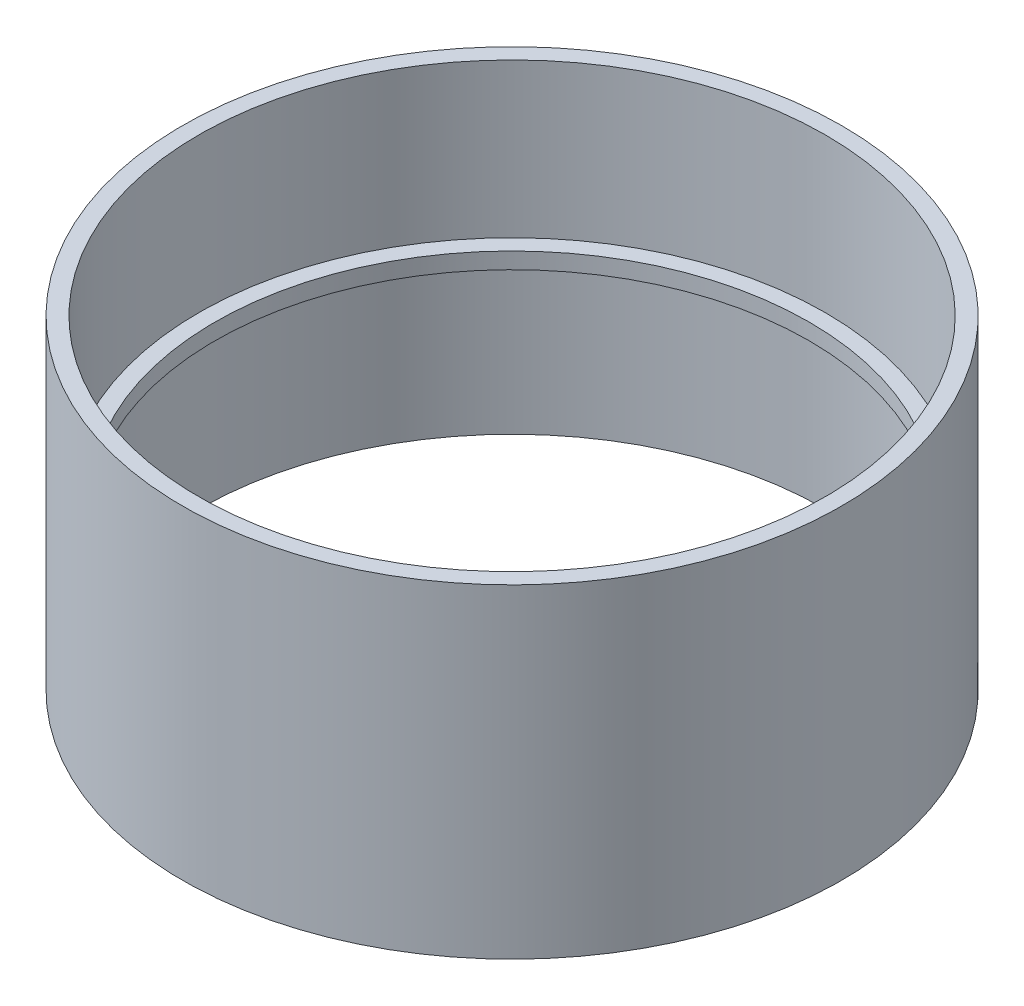
ISO-10303-21;
HEADER;
FILE_DESCRIPTION(('STEP AP214'),'2;1');
FILE_NAME('part.step','',(''),(''),'','','');
FILE_SCHEMA(('AUTOMOTIVE_DESIGN { 1 0 10303 214 1 1 1 1 }'));
ENDSEC;
DATA;
#1=APPLICATION_CONTEXT('core data for automotive mechanical design processes');
#2=APPLICATION_PROTOCOL_DEFINITION('international standard','automotive_design',2000,#1);
#3=PRODUCT_CONTEXT('',#1,'mechanical');
#4=PRODUCT('Part','Part','',(#3));
#5=PRODUCT_RELATED_PRODUCT_CATEGORY('part','',(#4));
#6=PRODUCT_DEFINITION_FORMATION('','',#4);
#7=PRODUCT_DEFINITION_CONTEXT('part definition',#1,'design');
#8=PRODUCT_DEFINITION('design','',#6,#7);
#9=PRODUCT_DEFINITION_SHAPE('','',#8);
#10=(LENGTH_UNIT() NAMED_UNIT(*) SI_UNIT(.MILLI.,.METRE.));
#11=(NAMED_UNIT(*) PLANE_ANGLE_UNIT() SI_UNIT($,.RADIAN.));
#12=(NAMED_UNIT(*) SI_UNIT($,.STERADIAN.) SOLID_ANGLE_UNIT());
#13=UNCERTAINTY_MEASURE_WITH_UNIT(LENGTH_MEASURE(1.E-05),#10,'distance_accuracy_value','');
#14=(GEOMETRIC_REPRESENTATION_CONTEXT(3) GLOBAL_UNCERTAINTY_ASSIGNED_CONTEXT((#13)) GLOBAL_UNIT_ASSIGNED_CONTEXT((#10,
#11,#12)) REPRESENTATION_CONTEXT('',''));
#15=CARTESIAN_POINT('',(0.,0.,0.));
#16=DIRECTION('',(0.,0.,1.));
#17=DIRECTION('',(1.,0.,0.));
#18=AXIS2_PLACEMENT_3D('',#15,#16,#17);
#19=CARTESIAN_POINT('',(0.,15.75,0.));
#20=DIRECTION('',(0.,1.,0.));
#21=DIRECTION('',(0.,0.,1.));
#22=AXIS2_PLACEMENT_3D('',#19,#20,#21);
#23=PLANE('',#22);
#24=CARTESIAN_POINT('',(0.,15.75,0.));
#25=DIRECTION('',(0.,-1.,0.));
#26=DIRECTION('',(0.,0.,-1.));
#27=AXIS2_PLACEMENT_3D('',#24,#25,#26);
#28=CIRCLE('',#27,27.5);
#29=CARTESIAN_POINT('',(0.,15.75,-27.5));
#30=VERTEX_POINT('',#29);
#31=EDGE_CURVE('E10',#30,#30,#28,.T.);
#32=ORIENTED_EDGE('',*,*,#31,.T.);
#33=EDGE_LOOP('',(#32));
#34=FACE_BOUND('',#33,.T.);
#35=CARTESIAN_POINT('',(0.,15.75,0.));
#36=DIRECTION('',(0.,-1.,0.));
#37=DIRECTION('',(0.,0.,-1.));
#38=AXIS2_PLACEMENT_3D('',#35,#36,#37);
#39=CIRCLE('',#38,29.);
#40=CARTESIAN_POINT('',(0.,15.75,-29.));
#41=VERTEX_POINT('',#40);
#42=EDGE_CURVE('E62',#41,#41,#39,.T.);
#43=ORIENTED_EDGE('',*,*,#42,.F.);
#44=EDGE_LOOP('',(#43));
#45=FACE_BOUND('',#44,.T.);
#46=ADVANCED_FACE('F34',(#34,#45),#23,.T.);
#47=CARTESIAN_POINT('',(0.,0.,0.));
#48=DIRECTION('',(0.,-1.,0.));
#49=DIRECTION('',(0.,0.,-1.));
#50=AXIS2_PLACEMENT_3D('',#47,#48,#49);
#51=CYLINDRICAL_SURFACE('',#50,27.5);
#52=CARTESIAN_POINT('',(0.,14.25,0.));
#53=DIRECTION('',(0.,-1.,0.));
#54=DIRECTION('',(0.,0.,-1.));
#55=AXIS2_PLACEMENT_3D('',#52,#53,#54);
#56=CIRCLE('',#55,27.5);
#57=CARTESIAN_POINT('',(0.,14.25,-27.5));
#58=VERTEX_POINT('',#57);
#59=EDGE_CURVE('E40',#58,#58,#56,.T.);
#60=ORIENTED_EDGE('',*,*,#59,.T.);
#61=EDGE_LOOP('',(#60));
#62=FACE_BOUND('',#61,.T.);
#63=ORIENTED_EDGE('',*,*,#31,.F.);
#64=EDGE_LOOP('',(#63));
#65=FACE_BOUND('',#64,.T.);
#66=ADVANCED_FACE('F69',(#62,#65),#51,.F.);
#67=CARTESIAN_POINT('',(0.,14.25,0.));
#68=DIRECTION('',(0.,1.,0.));
#69=DIRECTION('',(0.,0.,1.));
#70=AXIS2_PLACEMENT_3D('',#67,#68,#69);
#71=PLANE('',#70);
#72=ORIENTED_EDGE('',*,*,#59,.F.);
#73=EDGE_LOOP('',(#72));
#74=FACE_BOUND('',#73,.T.);
#75=CARTESIAN_POINT('',(0.,14.25,0.));
#76=DIRECTION('',(0.,-1.,0.));
#77=DIRECTION('',(0.,0.,-1.));
#78=AXIS2_PLACEMENT_3D('',#75,#76,#77);
#79=CIRCLE('',#78,29.);
#80=CARTESIAN_POINT('',(0.,14.25,-29.));
#81=VERTEX_POINT('',#80);
#82=EDGE_CURVE('E44',#81,#81,#79,.T.);
#83=ORIENTED_EDGE('',*,*,#82,.T.);
#84=EDGE_LOOP('',(#83));
#85=FACE_BOUND('',#84,.T.);
#86=ADVANCED_FACE('F73',(#74,#85),#71,.F.);
#87=CARTESIAN_POINT('',(0.,0.,0.));
#88=DIRECTION('',(0.,-1.,0.));
#89=DIRECTION('',(0.,0.,-1.));
#90=AXIS2_PLACEMENT_3D('',#87,#88,#89);
#91=CYLINDRICAL_SURFACE('',#90,29.);
#92=ORIENTED_EDGE('',*,*,#82,.F.);
#93=EDGE_LOOP('',(#92));
#94=FACE_BOUND('',#93,.T.);
#95=CARTESIAN_POINT('',(0.,0.,0.));
#96=DIRECTION('',(0.,-1.,0.));
#97=DIRECTION('',(0.,0.,-1.));
#98=AXIS2_PLACEMENT_3D('',#95,#96,#97);
#99=CIRCLE('',#98,29.);
#100=CARTESIAN_POINT('',(0.,0.,-29.));
#101=VERTEX_POINT('',#100);
#102=EDGE_CURVE('E48',#101,#101,#99,.T.);
#103=ORIENTED_EDGE('',*,*,#102,.T.);
#104=EDGE_LOOP('',(#103));
#105=FACE_BOUND('',#104,.T.);
#106=ADVANCED_FACE('F77',(#94,#105),#91,.F.);
#107=CARTESIAN_POINT('',(0.,0.,0.));
#108=DIRECTION('',(0.,-1.,0.));
#109=DIRECTION('',(0.,0.,-1.));
#110=AXIS2_PLACEMENT_3D('',#107,#108,#109);
#111=PLANE('',#110);
#112=CARTESIAN_POINT('',(0.,0.,0.));
#113=DIRECTION('',(0.,-1.,0.));
#114=DIRECTION('',(0.,0.,-1.));
#115=AXIS2_PLACEMENT_3D('',#112,#113,#114);
#116=CIRCLE('',#115,30.5);
#117=CARTESIAN_POINT('',(0.,0.,-30.5));
#118=VERTEX_POINT('',#117);
#119=EDGE_CURVE('E53',#118,#118,#116,.T.);
#120=ORIENTED_EDGE('',*,*,#119,.T.);
#121=EDGE_LOOP('',(#120));
#122=FACE_BOUND('',#121,.T.);
#123=ORIENTED_EDGE('',*,*,#102,.F.);
#124=EDGE_LOOP('',(#123));
#125=FACE_BOUND('',#124,.T.);
#126=ADVANCED_FACE('F82',(#122,#125),#111,.T.);
#127=CARTESIAN_POINT('',(0.,0.,0.));
#128=DIRECTION('',(0.,-1.,0.));
#129=DIRECTION('',(0.,0.,-1.));
#130=AXIS2_PLACEMENT_3D('',#127,#128,#129);
#131=CYLINDRICAL_SURFACE('',#130,30.5);
#132=CARTESIAN_POINT('',(0.,30.,0.));
#133=DIRECTION('',(0.,-1.,0.));
#134=DIRECTION('',(0.,0.,-1.));
#135=AXIS2_PLACEMENT_3D('',#132,#133,#134);
#136=CIRCLE('',#135,30.5);
#137=CARTESIAN_POINT('',(0.,30.,-30.5));
#138=VERTEX_POINT('',#137);
#139=EDGE_CURVE('E56',#138,#138,#136,.T.);
#140=ORIENTED_EDGE('',*,*,#139,.T.);
#141=EDGE_LOOP('',(#140));
#142=FACE_BOUND('',#141,.T.);
#143=ORIENTED_EDGE('',*,*,#119,.F.);
#144=EDGE_LOOP('',(#143));
#145=FACE_BOUND('',#144,.T.);
#146=ADVANCED_FACE('F85',(#142,#145),#131,.T.);
#147=CARTESIAN_POINT('',(0.,30.,0.));
#148=DIRECTION('',(0.,-1.,0.));
#149=DIRECTION('',(0.,0.,-1.));
#150=AXIS2_PLACEMENT_3D('',#147,#148,#149);
#151=PLANE('',#150);
#152=ORIENTED_EDGE('',*,*,#139,.F.);
#153=EDGE_LOOP('',(#152));
#154=FACE_BOUND('',#153,.T.);
#155=CARTESIAN_POINT('',(0.,30.,0.));
#156=DIRECTION('',(0.,-1.,0.));
#157=DIRECTION('',(0.,0.,-1.));
#158=AXIS2_PLACEMENT_3D('',#155,#156,#157);
#159=CIRCLE('',#158,29.);
#160=CARTESIAN_POINT('',(0.,30.,-29.));
#161=VERTEX_POINT('',#160);
#162=EDGE_CURVE('E59',#161,#161,#159,.T.);
#163=ORIENTED_EDGE('',*,*,#162,.T.);
#164=EDGE_LOOP('',(#163));
#165=FACE_BOUND('',#164,.T.);
#166=ADVANCED_FACE('F89',(#154,#165),#151,.F.);
#167=ORIENTED_EDGE('',*,*,#162,.F.);
#168=EDGE_LOOP('',(#167));
#169=FACE_BOUND('',#168,.T.);
#170=ORIENTED_EDGE('',*,*,#42,.T.);
#171=EDGE_LOOP('',(#170));
#172=FACE_BOUND('',#171,.T.);
#173=ADVANCED_FACE('F66',(#169,#172),#91,.F.);
#174=CLOSED_SHELL('',(#46,#66,#86,#106,#126,#146,#166,#173));
#175=MANIFOLD_SOLID_BREP('B2',#174);
#176=ADVANCED_BREP_SHAPE_REPRESENTATION('',(#18,#175),#14);
#177=SHAPE_DEFINITION_REPRESENTATION(#9,#176);
ENDSEC;
END-ISO-10303-21;
